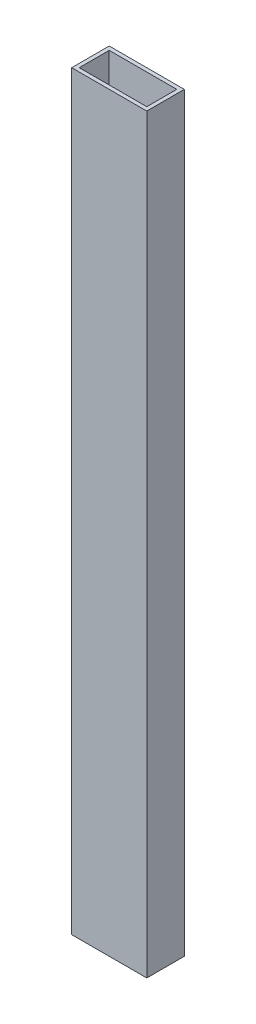
ISO-10303-21;
HEADER;
FILE_DESCRIPTION(('STEP AP214'),'2;1');
FILE_NAME('part.step','',(''),(''),'','','');
FILE_SCHEMA(('AUTOMOTIVE_DESIGN { 1 0 10303 214 1 1 1 1 }'));
ENDSEC;
DATA;
#1=APPLICATION_CONTEXT('core data for automotive mechanical design processes');
#2=APPLICATION_PROTOCOL_DEFINITION('international standard','automotive_design',2000,#1);
#3=PRODUCT_CONTEXT('',#1,'mechanical');
#4=PRODUCT('Part','Part','',(#3));
#5=PRODUCT_RELATED_PRODUCT_CATEGORY('part','',(#4));
#6=PRODUCT_DEFINITION_FORMATION('','',#4);
#7=PRODUCT_DEFINITION_CONTEXT('part definition',#1,'design');
#8=PRODUCT_DEFINITION('design','',#6,#7);
#9=PRODUCT_DEFINITION_SHAPE('','',#8);
#10=(LENGTH_UNIT() NAMED_UNIT(*) SI_UNIT(.MILLI.,.METRE.));
#11=(NAMED_UNIT(*) PLANE_ANGLE_UNIT() SI_UNIT($,.RADIAN.));
#12=(NAMED_UNIT(*) SI_UNIT($,.STERADIAN.) SOLID_ANGLE_UNIT());
#13=UNCERTAINTY_MEASURE_WITH_UNIT(LENGTH_MEASURE(1.E-05),#10,'distance_accuracy_value','');
#14=(GEOMETRIC_REPRESENTATION_CONTEXT(3) GLOBAL_UNCERTAINTY_ASSIGNED_CONTEXT((#13)) GLOBAL_UNIT_ASSIGNED_CONTEXT((#10,
#11,#12)) REPRESENTATION_CONTEXT('',''));
#15=CARTESIAN_POINT('',(0.,0.,0.));
#16=DIRECTION('',(0.,0.,1.));
#17=DIRECTION('',(1.,0.,0.));
#18=AXIS2_PLACEMENT_3D('',#15,#16,#17);
#19=CARTESIAN_POINT('',(20.,0.,10.));
#20=DIRECTION('',(-1.,0.,0.));
#21=DIRECTION('',(0.,0.,1.));
#22=AXIS2_PLACEMENT_3D('',#19,#20,#21);
#23=PLANE('',#22);
#24=DIRECTION('',(0.,-1.,0.));
#25=VECTOR('',#24,1.);
#26=CARTESIAN_POINT('',(20.,0.,-10.));
#27=LINE('',#26,#25);
#28=CARTESIAN_POINT('',(20.,0.,-10.));
#29=VERTEX_POINT('',#28);
#30=CARTESIAN_POINT('',(20.,-400.,-10.));
#31=VERTEX_POINT('',#30);
#32=EDGE_CURVE('E112',#29,#31,#27,.T.);
#33=ORIENTED_EDGE('',*,*,#32,.F.);
#34=DIRECTION('',(0.,0.,-1.));
#35=VECTOR('',#34,1.);
#36=CARTESIAN_POINT('',(20.,0.,10.));
#37=LINE('',#36,#35);
#38=CARTESIAN_POINT('',(20.,0.,10.));
#39=VERTEX_POINT('',#38);
#40=EDGE_CURVE('E98',#39,#29,#37,.T.);
#41=ORIENTED_EDGE('',*,*,#40,.F.);
#42=DIRECTION('',(0.,-1.,0.));
#43=VECTOR('',#42,1.);
#44=CARTESIAN_POINT('',(20.,0.,10.));
#45=LINE('',#44,#43);
#46=CARTESIAN_POINT('',(20.,-400.,10.));
#47=VERTEX_POINT('',#46);
#48=EDGE_CURVE('E107',#39,#47,#45,.T.);
#49=ORIENTED_EDGE('',*,*,#48,.T.);
#50=DIRECTION('',(0.,0.,-1.));
#51=VECTOR('',#50,1.);
#52=CARTESIAN_POINT('',(20.,-400.,10.));
#53=LINE('',#52,#51);
#54=EDGE_CURVE('E103',#47,#31,#53,.T.);
#55=ORIENTED_EDGE('',*,*,#54,.T.);
#56=EDGE_LOOP('',(#33,#41,#49,#55));
#57=FACE_BOUND('',#56,.T.);
#58=ADVANCED_FACE('F39',(#57),#23,.F.);
#59=CARTESIAN_POINT('',(-20.,0.,-10.));
#60=DIRECTION('',(0.,0.,1.));
#61=DIRECTION('',(1.,0.,0.));
#62=AXIS2_PLACEMENT_3D('',#59,#60,#61);
#63=PLANE('',#62);
#64=DIRECTION('',(0.,-1.,0.));
#65=VECTOR('',#64,1.);
#66=CARTESIAN_POINT('',(-20.,0.,-10.));
#67=LINE('',#66,#65);
#68=CARTESIAN_POINT('',(-20.,0.,-10.));
#69=VERTEX_POINT('',#68);
#70=CARTESIAN_POINT('',(-20.,-400.,-10.));
#71=VERTEX_POINT('',#70);
#72=EDGE_CURVE('E122',#69,#71,#67,.T.);
#73=ORIENTED_EDGE('',*,*,#72,.F.);
#74=DIRECTION('',(-1.,0.,0.));
#75=VECTOR('',#74,1.);
#76=CARTESIAN_POINT('',(-20.,0.,-10.));
#77=LINE('',#76,#75);
#78=EDGE_CURVE('E117',#29,#69,#77,.T.);
#79=ORIENTED_EDGE('',*,*,#78,.F.);
#80=ORIENTED_EDGE('',*,*,#32,.T.);
#81=DIRECTION('',(-1.,0.,0.));
#82=VECTOR('',#81,1.);
#83=CARTESIAN_POINT('',(-20.,-400.,-10.));
#84=LINE('',#83,#82);
#85=EDGE_CURVE('E137',#31,#71,#84,.T.);
#86=ORIENTED_EDGE('',*,*,#85,.T.);
#87=EDGE_LOOP('',(#73,#79,#80,#86));
#88=FACE_BOUND('',#87,.T.);
#89=ADVANCED_FACE('F138',(#88),#63,.F.);
#90=CARTESIAN_POINT('',(-20.,0.,10.));
#91=DIRECTION('',(1.,0.,0.));
#92=DIRECTION('',(0.,0.,-1.));
#93=AXIS2_PLACEMENT_3D('',#90,#91,#92);
#94=PLANE('',#93);
#95=DIRECTION('',(0.,-1.,0.));
#96=VECTOR('',#95,1.);
#97=CARTESIAN_POINT('',(-20.,0.,10.));
#98=LINE('',#97,#96);
#99=CARTESIAN_POINT('',(-20.,0.,10.));
#100=VERTEX_POINT('',#99);
#101=CARTESIAN_POINT('',(-20.,-400.,10.));
#102=VERTEX_POINT('',#101);
#103=EDGE_CURVE('E43',#100,#102,#98,.T.);
#104=ORIENTED_EDGE('',*,*,#103,.F.);
#105=DIRECTION('',(0.,0.,1.));
#106=VECTOR('',#105,1.);
#107=CARTESIAN_POINT('',(-20.,0.,10.));
#108=LINE('',#107,#106);
#109=EDGE_CURVE('E90',#69,#100,#108,.T.);
#110=ORIENTED_EDGE('',*,*,#109,.F.);
#111=ORIENTED_EDGE('',*,*,#72,.T.);
#112=DIRECTION('',(0.,0.,1.));
#113=VECTOR('',#112,1.);
#114=CARTESIAN_POINT('',(-20.,-400.,10.));
#115=LINE('',#114,#113);
#116=EDGE_CURVE('E135',#71,#102,#115,.T.);
#117=ORIENTED_EDGE('',*,*,#116,.T.);
#118=EDGE_LOOP('',(#104,#110,#111,#117));
#119=FACE_BOUND('',#118,.T.);
#120=ADVANCED_FACE('F134',(#119),#94,.F.);
#121=CARTESIAN_POINT('',(-20.,0.,10.));
#122=DIRECTION('',(0.,0.,-1.));
#123=DIRECTION('',(-1.,0.,0.));
#124=AXIS2_PLACEMENT_3D('',#121,#122,#123);
#125=PLANE('',#124);
#126=DIRECTION('',(1.,0.,0.));
#127=VECTOR('',#126,1.);
#128=CARTESIAN_POINT('',(-20.,-400.,10.));
#129=LINE('',#128,#127);
#130=EDGE_CURVE('E108',#102,#47,#129,.T.);
#131=ORIENTED_EDGE('',*,*,#130,.T.);
#132=ORIENTED_EDGE('',*,*,#48,.F.);
#133=DIRECTION('',(1.,0.,0.));
#134=VECTOR('',#133,1.);
#135=CARTESIAN_POINT('',(-20.,0.,10.));
#136=LINE('',#135,#134);
#137=EDGE_CURVE('E93',#100,#39,#136,.T.);
#138=ORIENTED_EDGE('',*,*,#137,.F.);
#139=ORIENTED_EDGE('',*,*,#103,.T.);
#140=EDGE_LOOP('',(#131,#132,#138,#139));
#141=FACE_BOUND('',#140,.T.);
#142=ADVANCED_FACE('F41',(#141),#125,.F.);
#143=CARTESIAN_POINT('',(0.,0.,0.));
#144=DIRECTION('',(0.,-1.,0.));
#145=DIRECTION('',(0.,0.,-1.));
#146=AXIS2_PLACEMENT_3D('',#143,#144,#145);
#147=PLANE('',#146);
#148=ORIENTED_EDGE('',*,*,#40,.T.);
#149=ORIENTED_EDGE('',*,*,#78,.T.);
#150=ORIENTED_EDGE('',*,*,#109,.T.);
#151=ORIENTED_EDGE('',*,*,#137,.T.);
#152=EDGE_LOOP('',(#148,#149,#150,#151));
#153=FACE_BOUND('',#152,.T.);
#154=DIRECTION('',(1.,0.,0.));
#155=VECTOR('',#154,1.);
#156=CARTESIAN_POINT('',(-18.,0.,8.));
#157=LINE('',#156,#155);
#158=CARTESIAN_POINT('',(18.,0.,8.));
#159=VERTEX_POINT('',#158);
#160=CARTESIAN_POINT('',(-18.,0.,8.));
#161=VERTEX_POINT('',#160);
#162=EDGE_CURVE('E149',#159,#161,#157,.F.);
#163=ORIENTED_EDGE('',*,*,#162,.T.);
#164=DIRECTION('',(0.,0.,1.));
#165=VECTOR('',#164,1.);
#166=CARTESIAN_POINT('',(-18.,0.,8.));
#167=LINE('',#166,#165);
#168=CARTESIAN_POINT('',(-18.,0.,-8.));
#169=VERTEX_POINT('',#168);
#170=EDGE_CURVE('E147',#161,#169,#167,.F.);
#171=ORIENTED_EDGE('',*,*,#170,.T.);
#172=DIRECTION('',(-1.,0.,0.));
#173=VECTOR('',#172,1.);
#174=CARTESIAN_POINT('',(-18.,0.,-8.));
#175=LINE('',#174,#173);
#176=CARTESIAN_POINT('',(18.,0.,-8.));
#177=VERTEX_POINT('',#176);
#178=EDGE_CURVE('E164',#169,#177,#175,.F.);
#179=ORIENTED_EDGE('',*,*,#178,.T.);
#180=DIRECTION('',(0.,0.,-1.));
#181=VECTOR('',#180,1.);
#182=CARTESIAN_POINT('',(18.,0.,8.));
#183=LINE('',#182,#181);
#184=EDGE_CURVE('E154',#177,#159,#183,.F.);
#185=ORIENTED_EDGE('',*,*,#184,.T.);
#186=EDGE_LOOP('',(#163,#171,#179,#185));
#187=FACE_BOUND('',#186,.T.);
#188=ADVANCED_FACE('F95',(#153,#187),#147,.F.);
#189=CARTESIAN_POINT('',(0.,-400.,0.));
#190=DIRECTION('',(0.,-1.,0.));
#191=DIRECTION('',(0.,0.,-1.));
#192=AXIS2_PLACEMENT_3D('',#189,#190,#191);
#193=PLANE('',#192);
#194=ORIENTED_EDGE('',*,*,#54,.F.);
#195=ORIENTED_EDGE('',*,*,#130,.F.);
#196=ORIENTED_EDGE('',*,*,#116,.F.);
#197=ORIENTED_EDGE('',*,*,#85,.F.);
#198=EDGE_LOOP('',(#194,#195,#196,#197));
#199=FACE_BOUND('',#198,.T.);
#200=DIRECTION('',(1.,0.,0.));
#201=VECTOR('',#200,1.);
#202=CARTESIAN_POINT('',(-18.,-400.,8.));
#203=LINE('',#202,#201);
#204=CARTESIAN_POINT('',(18.,-400.,8.));
#205=VERTEX_POINT('',#204);
#206=CARTESIAN_POINT('',(-18.,-400.,8.));
#207=VERTEX_POINT('',#206);
#208=EDGE_CURVE('E11',#205,#207,#203,.F.);
#209=ORIENTED_EDGE('',*,*,#208,.F.);
#210=DIRECTION('',(0.,0.,-1.));
#211=VECTOR('',#210,1.);
#212=CARTESIAN_POINT('',(18.,-400.,8.));
#213=LINE('',#212,#211);
#214=CARTESIAN_POINT('',(18.,-400.,-8.));
#215=VERTEX_POINT('',#214);
#216=EDGE_CURVE('E59',#215,#205,#213,.F.);
#217=ORIENTED_EDGE('',*,*,#216,.F.);
#218=DIRECTION('',(-1.,0.,0.));
#219=VECTOR('',#218,1.);
#220=CARTESIAN_POINT('',(-18.,-400.,-8.));
#221=LINE('',#220,#219);
#222=CARTESIAN_POINT('',(-18.,-400.,-8.));
#223=VERTEX_POINT('',#222);
#224=EDGE_CURVE('E167',#223,#215,#221,.F.);
#225=ORIENTED_EDGE('',*,*,#224,.F.);
#226=DIRECTION('',(0.,0.,1.));
#227=VECTOR('',#226,1.);
#228=CARTESIAN_POINT('',(-18.,-400.,8.));
#229=LINE('',#228,#227);
#230=EDGE_CURVE('E177',#207,#223,#229,.F.);
#231=ORIENTED_EDGE('',*,*,#230,.F.);
#232=EDGE_LOOP('',(#209,#217,#225,#231));
#233=FACE_BOUND('',#232,.T.);
#234=ADVANCED_FACE('F219',(#199,#233),#193,.T.);
#235=CARTESIAN_POINT('',(-18.,0.,8.));
#236=DIRECTION('',(-1.,0.,0.));
#237=DIRECTION('',(0.,0.,1.));
#238=AXIS2_PLACEMENT_3D('',#235,#236,#237);
#239=PLANE('',#238);
#240=DIRECTION('',(0.,-1.,0.));
#241=VECTOR('',#240,1.);
#242=CARTESIAN_POINT('',(-18.,0.,-8.));
#243=LINE('',#242,#241);
#244=EDGE_CURVE('E170',#169,#223,#243,.T.);
#245=ORIENTED_EDGE('',*,*,#244,.F.);
#246=ORIENTED_EDGE('',*,*,#170,.F.);
#247=DIRECTION('',(0.,-1.,0.));
#248=VECTOR('',#247,1.);
#249=CARTESIAN_POINT('',(-18.,0.,8.));
#250=LINE('',#249,#248);
#251=EDGE_CURVE('E153',#161,#207,#250,.T.);
#252=ORIENTED_EDGE('',*,*,#251,.T.);
#253=ORIENTED_EDGE('',*,*,#230,.T.);
#254=EDGE_LOOP('',(#245,#246,#252,#253));
#255=FACE_BOUND('',#254,.T.);
#256=ADVANCED_FACE('F196',(#255),#239,.F.);
#257=CARTESIAN_POINT('',(-18.,0.,-8.));
#258=DIRECTION('',(0.,0.,-1.));
#259=DIRECTION('',(-1.,0.,0.));
#260=AXIS2_PLACEMENT_3D('',#257,#258,#259);
#261=PLANE('',#260);
#262=DIRECTION('',(0.,-1.,0.));
#263=VECTOR('',#262,1.);
#264=CARTESIAN_POINT('',(18.,0.,-8.));
#265=LINE('',#264,#263);
#266=EDGE_CURVE('E160',#177,#215,#265,.T.);
#267=ORIENTED_EDGE('',*,*,#266,.F.);
#268=ORIENTED_EDGE('',*,*,#178,.F.);
#269=ORIENTED_EDGE('',*,*,#244,.T.);
#270=ORIENTED_EDGE('',*,*,#224,.T.);
#271=EDGE_LOOP('',(#267,#268,#269,#270));
#272=FACE_BOUND('',#271,.T.);
#273=ADVANCED_FACE('F200',(#272),#261,.F.);
#274=CARTESIAN_POINT('',(18.,0.,8.));
#275=DIRECTION('',(1.,0.,0.));
#276=DIRECTION('',(0.,0.,-1.));
#277=AXIS2_PLACEMENT_3D('',#274,#275,#276);
#278=PLANE('',#277);
#279=DIRECTION('',(0.,-1.,0.));
#280=VECTOR('',#279,1.);
#281=CARTESIAN_POINT('',(18.,0.,8.));
#282=LINE('',#281,#280);
#283=EDGE_CURVE('E50',#159,#205,#282,.T.);
#284=ORIENTED_EDGE('',*,*,#283,.F.);
#285=ORIENTED_EDGE('',*,*,#184,.F.);
#286=ORIENTED_EDGE('',*,*,#266,.T.);
#287=ORIENTED_EDGE('',*,*,#216,.T.);
#288=EDGE_LOOP('',(#284,#285,#286,#287));
#289=FACE_BOUND('',#288,.T.);
#290=ADVANCED_FACE('F208',(#289),#278,.F.);
#291=CARTESIAN_POINT('',(-18.,0.,8.));
#292=DIRECTION('',(0.,0.,1.));
#293=DIRECTION('',(1.,0.,0.));
#294=AXIS2_PLACEMENT_3D('',#291,#292,#293);
#295=PLANE('',#294);
#296=ORIENTED_EDGE('',*,*,#208,.T.);
#297=ORIENTED_EDGE('',*,*,#251,.F.);
#298=ORIENTED_EDGE('',*,*,#162,.F.);
#299=ORIENTED_EDGE('',*,*,#283,.T.);
#300=EDGE_LOOP('',(#296,#297,#298,#299));
#301=FACE_BOUND('',#300,.T.);
#302=ADVANCED_FACE('F207',(#301),#295,.F.);
#303=CLOSED_SHELL('',(#58,#89,#120,#142,#188,#234,#256,#273,#290,#302));
#304=MANIFOLD_SOLID_BREP('B2',#303);
#305=ADVANCED_BREP_SHAPE_REPRESENTATION('',(#18,#304),#14);
#306=SHAPE_DEFINITION_REPRESENTATION(#9,#305);
ENDSEC;
END-ISO-10303-21;
